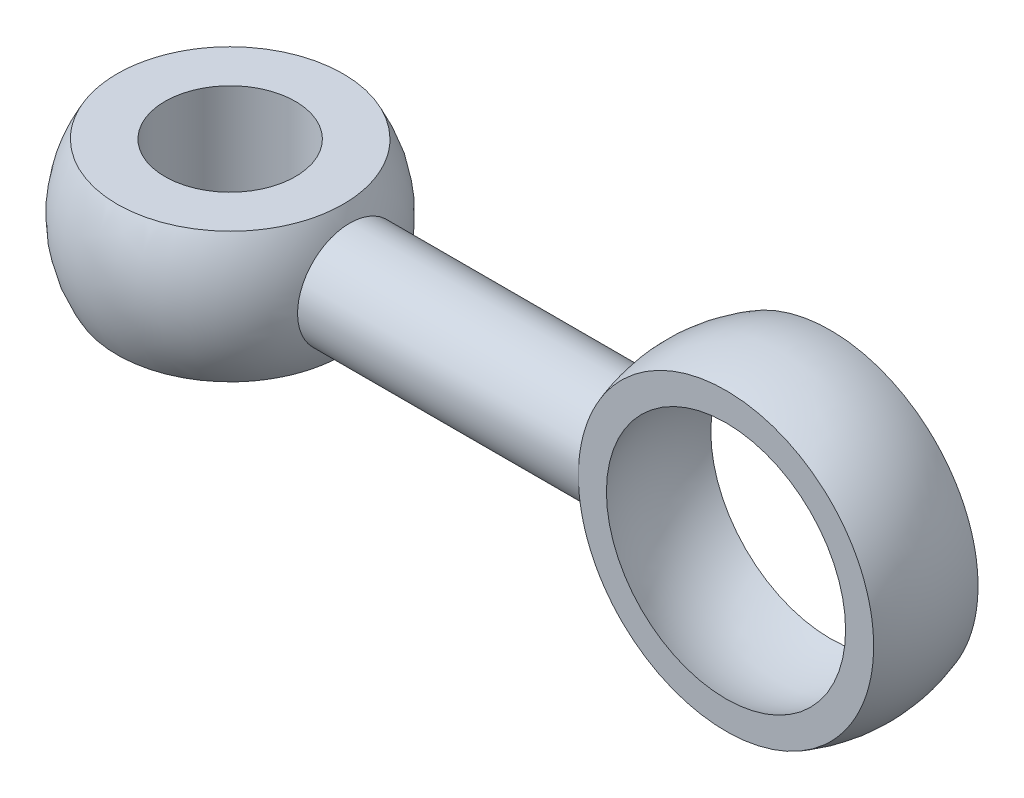
ISO-10303-21;
HEADER;
FILE_DESCRIPTION(('STEP AP214'),'2;1');
FILE_NAME('part.step','',(''),(''),'','','');
FILE_SCHEMA(('AUTOMOTIVE_DESIGN { 1 0 10303 214 1 1 1 1 }'));
ENDSEC;
DATA;
#1=APPLICATION_CONTEXT('core data for automotive mechanical design processes');
#2=APPLICATION_PROTOCOL_DEFINITION('international standard','automotive_design',2000,#1);
#3=PRODUCT_CONTEXT('',#1,'mechanical');
#4=PRODUCT('Part','Part','',(#3));
#5=PRODUCT_RELATED_PRODUCT_CATEGORY('part','',(#4));
#6=PRODUCT_DEFINITION_FORMATION('','',#4);
#7=PRODUCT_DEFINITION_CONTEXT('part definition',#1,'design');
#8=PRODUCT_DEFINITION('design','',#6,#7);
#9=PRODUCT_DEFINITION_SHAPE('','',#8);
#10=(LENGTH_UNIT() NAMED_UNIT(*) SI_UNIT(.MILLI.,.METRE.));
#11=(NAMED_UNIT(*) PLANE_ANGLE_UNIT() SI_UNIT($,.RADIAN.));
#12=(NAMED_UNIT(*) SI_UNIT($,.STERADIAN.) SOLID_ANGLE_UNIT());
#13=UNCERTAINTY_MEASURE_WITH_UNIT(LENGTH_MEASURE(1.E-05),#10,'distance_accuracy_value','');
#14=(GEOMETRIC_REPRESENTATION_CONTEXT(3) GLOBAL_UNCERTAINTY_ASSIGNED_CONTEXT((#13)) GLOBAL_UNIT_ASSIGNED_CONTEXT((#10,
#11,#12)) REPRESENTATION_CONTEXT('',''));
#15=CARTESIAN_POINT('',(0.,0.,0.));
#16=DIRECTION('',(0.,0.,1.));
#17=DIRECTION('',(1.,0.,0.));
#18=AXIS2_PLACEMENT_3D('',#15,#16,#17);
#19=CARTESIAN_POINT('',(-13.5102645286488,0.,0.));
#20=DIRECTION('',(1.,0.,0.));
#21=DIRECTION('',(0.,1.,0.));
#22=AXIS2_PLACEMENT_3D('',#19,#20,#21);
#23=SPHERICAL_SURFACE('',#22,5.);
#24=CARTESIAN_POINT('',(-13.5102645286488,-2.5,0.));
#25=DIRECTION('',(0.,1.,0.));
#26=DIRECTION('',(-1.,0.,0.));
#27=AXIS2_PLACEMENT_3D('',#24,#25,#26);
#28=CIRCLE('',#27,4.33012701892219);
#29=CARTESIAN_POINT('',(-17.840391547571,-2.5,0.));
#30=VERTEX_POINT('',#29);
#31=EDGE_CURVE('E47',#30,#30,#28,.F.);
#32=ORIENTED_EDGE('',*,*,#31,.F.);
#33=EDGE_LOOP('',(#32));
#34=FACE_BOUND('',#33,.T.);
#35=CARTESIAN_POINT('',(-8.92768883369292,0.,0.));
#36=DIRECTION('',(1.,0.,0.));
#37=DIRECTION('',(0.,1.,0.));
#38=AXIS2_PLACEMENT_3D('',#35,#36,#37);
#39=CIRCLE('',#38,2.);
#40=CARTESIAN_POINT('',(-8.92768883369292,2.,0.));
#41=VERTEX_POINT('',#40);
#42=EDGE_CURVE('E53',#41,#41,#39,.T.);
#43=ORIENTED_EDGE('',*,*,#42,.F.);
#44=EDGE_LOOP('',(#43));
#45=FACE_BOUND('',#44,.T.);
#46=CARTESIAN_POINT('',(-13.5102645286488,2.5,0.));
#47=DIRECTION('',(0.,1.,0.));
#48=DIRECTION('',(-1.,0.,0.));
#49=AXIS2_PLACEMENT_3D('',#46,#47,#48);
#50=CIRCLE('',#49,4.33012701892219);
#51=CARTESIAN_POINT('',(-17.840391547571,2.5,0.));
#52=VERTEX_POINT('',#51);
#53=EDGE_CURVE('E42',#52,#52,#50,.F.);
#54=ORIENTED_EDGE('',*,*,#53,.T.);
#55=EDGE_LOOP('',(#54));
#56=FACE_BOUND('',#55,.T.);
#57=ADVANCED_FACE('F17',(#34,#45,#56),#23,.T.);
#58=CARTESIAN_POINT('',(7.48973547135125,0.,0.));
#59=DIRECTION('',(1.,0.,0.));
#60=DIRECTION('',(0.,1.,0.));
#61=AXIS2_PLACEMENT_3D('',#58,#59,#60);
#62=SPHERICAL_SURFACE('',#61,6.);
#63=CARTESIAN_POINT('',(1.83288122185887,0.,0.));
#64=DIRECTION('',(1.,0.,0.));
#65=DIRECTION('',(0.,1.,0.));
#66=AXIS2_PLACEMENT_3D('',#63,#64,#65);
#67=CIRCLE('',#66,2.);
#68=CARTESIAN_POINT('',(1.83288122185887,0.,2.));
#69=VERTEX_POINT('',#68);
#70=CARTESIAN_POINT('',(1.83288122185887,0.,-2.));
#71=VERTEX_POINT('',#70);
#72=EDGE_CURVE('E37',#69,#71,#67,.T.);
#73=ORIENTED_EDGE('',*,*,#72,.T.);
#74=CARTESIAN_POINT('',(7.48973547135125,0.,-2.));
#75=DIRECTION('',(0.,0.,1.));
#76=DIRECTION('',(1.,0.,0.));
#77=AXIS2_PLACEMENT_3D('',#74,#75,#76);
#78=CIRCLE('',#77,5.65685424949238);
#79=EDGE_CURVE('E11',#71,#71,#78,.F.);
#80=ORIENTED_EDGE('',*,*,#79,.F.);
#81=EDGE_CURVE('E39',#71,#69,#67,.T.);
#82=ORIENTED_EDGE('',*,*,#81,.T.);
#83=CARTESIAN_POINT('',(7.48973547135125,0.,2.));
#84=DIRECTION('',(0.,0.,-1.));
#85=DIRECTION('',(-1.,0.,0.));
#86=AXIS2_PLACEMENT_3D('',#83,#84,#85);
#87=CIRCLE('',#86,5.65685424949238);
#88=EDGE_CURVE('E27',#69,#69,#87,.F.);
#89=ORIENTED_EDGE('',*,*,#88,.F.);
#90=EDGE_LOOP('',(#73,#80,#82,#89));
#91=FACE_BOUND('',#90,.T.);
#92=ADVANCED_FACE('F19',(#91),#62,.T.);
#93=CARTESIAN_POINT('',(13.4897354713512,0.,0.));
#94=DIRECTION('',(1.,0.,0.));
#95=DIRECTION('',(0.,1.,0.));
#96=AXIS2_PLACEMENT_3D('',#93,#94,#95);
#97=CYLINDRICAL_SURFACE('',#96,2.);
#98=ORIENTED_EDGE('',*,*,#42,.T.);
#99=EDGE_LOOP('',(#98));
#100=FACE_BOUND('',#99,.T.);
#101=ORIENTED_EDGE('',*,*,#72,.F.);
#102=ORIENTED_EDGE('',*,*,#81,.F.);
#103=EDGE_LOOP('',(#101,#102));
#104=FACE_BOUND('',#103,.T.);
#105=ADVANCED_FACE('F95',(#100,#104),#97,.T.);
#106=CARTESIAN_POINT('',(0.,-2.5,-5.));
#107=DIRECTION('',(0.,1.,0.));
#108=DIRECTION('',(-1.,0.,0.));
#109=AXIS2_PLACEMENT_3D('',#106,#107,#108);
#110=PLANE('',#109);
#111=CARTESIAN_POINT('',(-13.5102645286488,-2.5,0.));
#112=DIRECTION('',(0.,1.,0.));
#113=DIRECTION('',(-1.,0.,0.));
#114=AXIS2_PLACEMENT_3D('',#111,#112,#113);
#115=CIRCLE('',#114,2.5);
#116=CARTESIAN_POINT('',(-16.0102645286488,-2.5,0.));
#117=VERTEX_POINT('',#116);
#118=EDGE_CURVE('E59',#117,#117,#115,.T.);
#119=ORIENTED_EDGE('',*,*,#118,.T.);
#120=EDGE_LOOP('',(#119));
#121=FACE_BOUND('',#120,.T.);
#122=ORIENTED_EDGE('',*,*,#31,.T.);
#123=EDGE_LOOP('',(#122));
#124=FACE_BOUND('',#123,.T.);
#125=ADVANCED_FACE('F101',(#121,#124),#110,.F.);
#126=CARTESIAN_POINT('',(0.,2.5,-5.));
#127=DIRECTION('',(0.,1.,0.));
#128=DIRECTION('',(-1.,0.,0.));
#129=AXIS2_PLACEMENT_3D('',#126,#127,#128);
#130=PLANE('',#129);
#131=CARTESIAN_POINT('',(-13.5102645286488,2.5,0.));
#132=DIRECTION('',(0.,1.,0.));
#133=DIRECTION('',(-1.,0.,0.));
#134=AXIS2_PLACEMENT_3D('',#131,#132,#133);
#135=CIRCLE('',#134,2.5);
#136=CARTESIAN_POINT('',(-16.0102645286488,2.5,0.));
#137=VERTEX_POINT('',#136);
#138=EDGE_CURVE('E63',#137,#137,#135,.T.);
#139=ORIENTED_EDGE('',*,*,#138,.F.);
#140=EDGE_LOOP('',(#139));
#141=FACE_BOUND('',#140,.T.);
#142=ORIENTED_EDGE('',*,*,#53,.F.);
#143=EDGE_LOOP('',(#142));
#144=FACE_BOUND('',#143,.T.);
#145=ADVANCED_FACE('F105',(#141,#144),#130,.T.);
#146=CARTESIAN_POINT('',(-13.5102645286488,-7.5,0.));
#147=DIRECTION('',(0.,1.,0.));
#148=DIRECTION('',(-1.,0.,0.));
#149=AXIS2_PLACEMENT_3D('',#146,#147,#148);
#150=CYLINDRICAL_SURFACE('',#149,2.5);
#151=ORIENTED_EDGE('',*,*,#138,.T.);
#152=EDGE_LOOP('',(#151));
#153=FACE_BOUND('',#152,.T.);
#154=ORIENTED_EDGE('',*,*,#118,.F.);
#155=EDGE_LOOP('',(#154));
#156=FACE_BOUND('',#155,.T.);
#157=ADVANCED_FACE('F109',(#153,#156),#150,.F.);
#158=CARTESIAN_POINT('',(1.83288122185887,-6.,2.));
#159=DIRECTION('',(0.,0.,-1.));
#160=DIRECTION('',(-1.,0.,0.));
#161=AXIS2_PLACEMENT_3D('',#158,#159,#160);
#162=PLANE('',#161);
#163=CARTESIAN_POINT('',(7.48973547135124,0.,2.));
#164=DIRECTION('',(0.,0.,-1.));
#165=DIRECTION('',(-1.,0.,0.));
#166=AXIS2_PLACEMENT_3D('',#163,#164,#165);
#167=CIRCLE('',#166,4.58257569495584);
#168=CARTESIAN_POINT('',(2.9071597763954,0.,2.));
#169=VERTEX_POINT('',#168);
#170=EDGE_CURVE('E67',#169,#169,#167,.T.);
#171=ORIENTED_EDGE('',*,*,#170,.T.);
#172=EDGE_LOOP('',(#171));
#173=FACE_BOUND('',#172,.T.);
#174=ORIENTED_EDGE('',*,*,#88,.T.);
#175=EDGE_LOOP('',(#174));
#176=FACE_BOUND('',#175,.T.);
#177=ADVANCED_FACE('F87',(#173,#176),#162,.F.);
#178=CARTESIAN_POINT('',(1.83288122185887,-6.,-2.));
#179=DIRECTION('',(0.,0.,1.));
#180=DIRECTION('',(1.,0.,0.));
#181=AXIS2_PLACEMENT_3D('',#178,#179,#180);
#182=PLANE('',#181);
#183=CARTESIAN_POINT('',(7.48973547135124,0.,-2.));
#184=DIRECTION('',(0.,0.,1.));
#185=DIRECTION('',(1.,0.,0.));
#186=AXIS2_PLACEMENT_3D('',#183,#184,#185);
#187=CIRCLE('',#186,4.58257569495584);
#188=CARTESIAN_POINT('',(12.0723111663071,0.,-2.));
#189=VERTEX_POINT('',#188);
#190=EDGE_CURVE('E21',#189,#189,#187,.T.);
#191=ORIENTED_EDGE('',*,*,#190,.T.);
#192=EDGE_LOOP('',(#191));
#193=FACE_BOUND('',#192,.T.);
#194=ORIENTED_EDGE('',*,*,#79,.T.);
#195=EDGE_LOOP('',(#194));
#196=FACE_BOUND('',#195,.T.);
#197=ADVANCED_FACE('F76',(#193,#196),#182,.F.);
#198=CARTESIAN_POINT('',(7.48973547135124,0.,0.));
#199=DIRECTION('',(0.,-1.,0.));
#200=DIRECTION('',(1.,0.,0.));
#201=AXIS2_PLACEMENT_3D('',#198,#199,#200);
#202=SPHERICAL_SURFACE('',#201,5.);
#203=CARTESIAN_POINT('',(7.48973547135124,0.,0.));
#204=DIRECTION('',(0.,0.,1.));
#205=DIRECTION('',(1.,0.,0.));
#206=AXIS2_PLACEMENT_3D('',#203,#204,#205);
#207=SPHERICAL_SURFACE('',#206,5.);
#208=ORIENTED_EDGE('',*,*,#190,.F.);
#209=EDGE_LOOP('',(#208));
#210=FACE_BOUND('',#209,.T.);
#211=ORIENTED_EDGE('',*,*,#170,.F.);
#212=EDGE_LOOP('',(#211));
#213=FACE_BOUND('',#212,.T.);
#214=ADVANCED_FACE('F78',(#210,#213),#207,.F.);
#215=CLOSED_SHELL('',(#57,#92,#105,#125,#145,#157,#177,#197,#214));
#216=MANIFOLD_SOLID_BREP('B1',#215);
#217=ADVANCED_BREP_SHAPE_REPRESENTATION('',(#18,#216),#14);
#218=SHAPE_DEFINITION_REPRESENTATION(#9,#217);
ENDSEC;
END-ISO-10303-21;
